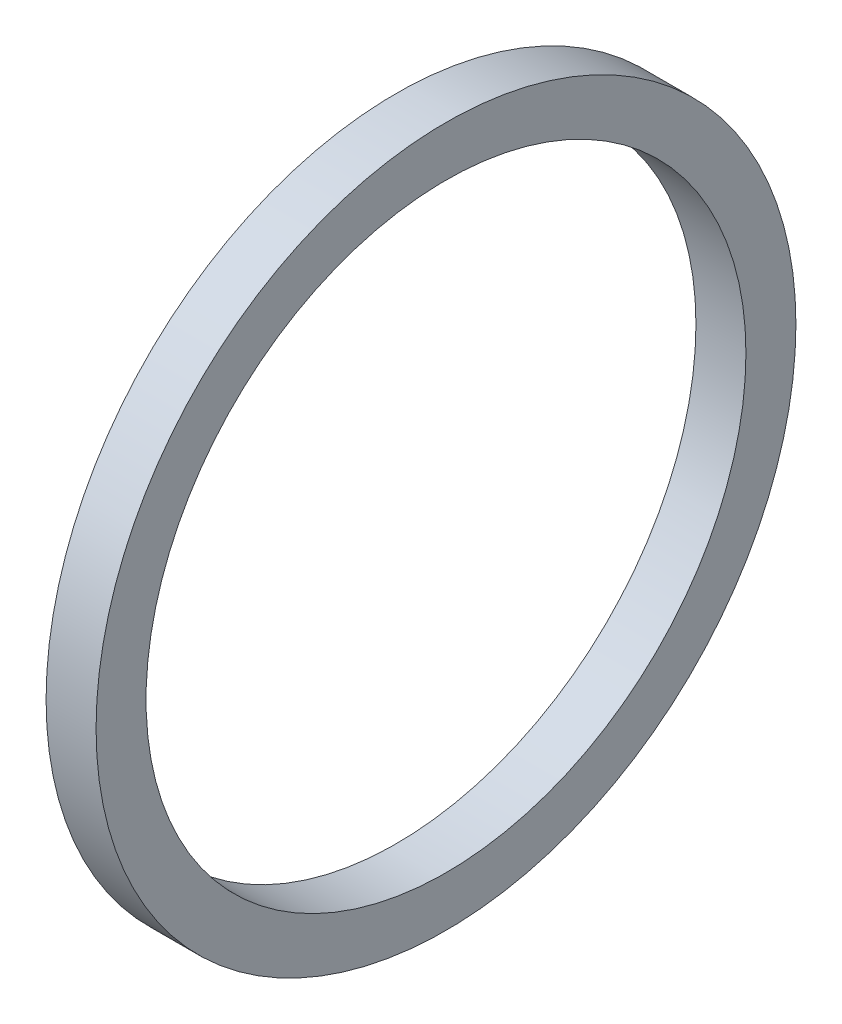
ISO-10303-21;
HEADER;
FILE_DESCRIPTION(('STEP AP214'),'2;1');
FILE_NAME('part.step','',(''),(''),'','','');
FILE_SCHEMA(('AUTOMOTIVE_DESIGN { 1 0 10303 214 1 1 1 1 }'));
ENDSEC;
DATA;
#1=APPLICATION_CONTEXT('core data for automotive mechanical design processes');
#2=APPLICATION_PROTOCOL_DEFINITION('international standard','automotive_design',2000,#1);
#3=PRODUCT_CONTEXT('',#1,'mechanical');
#4=PRODUCT('Part','Part','',(#3));
#5=PRODUCT_RELATED_PRODUCT_CATEGORY('part','',(#4));
#6=PRODUCT_DEFINITION_FORMATION('','',#4);
#7=PRODUCT_DEFINITION_CONTEXT('part definition',#1,'design');
#8=PRODUCT_DEFINITION('design','',#6,#7);
#9=PRODUCT_DEFINITION_SHAPE('','',#8);
#10=(LENGTH_UNIT() NAMED_UNIT(*) SI_UNIT(.MILLI.,.METRE.));
#11=(NAMED_UNIT(*) PLANE_ANGLE_UNIT() SI_UNIT($,.RADIAN.));
#12=(NAMED_UNIT(*) SI_UNIT($,.STERADIAN.) SOLID_ANGLE_UNIT());
#13=UNCERTAINTY_MEASURE_WITH_UNIT(LENGTH_MEASURE(1.E-05),#10,'distance_accuracy_value','');
#14=(GEOMETRIC_REPRESENTATION_CONTEXT(3) GLOBAL_UNCERTAINTY_ASSIGNED_CONTEXT((#13)) GLOBAL_UNIT_ASSIGNED_CONTEXT((#10,
#11,#12)) REPRESENTATION_CONTEXT('',''));
#15=CARTESIAN_POINT('',(0.,0.,0.));
#16=DIRECTION('',(0.,0.,1.));
#17=DIRECTION('',(1.,0.,0.));
#18=AXIS2_PLACEMENT_3D('',#15,#16,#17);
#19=CARTESIAN_POINT('',(0.,76.2,0.));
#20=DIRECTION('',(1.,0.,0.));
#21=DIRECTION('',(0.,0.,-1.));
#22=AXIS2_PLACEMENT_3D('',#19,#20,#21);
#23=PLANE('',#22);
#24=CARTESIAN_POINT('',(0.,0.,0.));
#25=DIRECTION('',(1.,0.,0.));
#26=DIRECTION('',(0.,0.,-1.));
#27=AXIS2_PLACEMENT_3D('',#24,#25,#26);
#28=CIRCLE('',#27,88.9);
#29=CARTESIAN_POINT('',(0.,0.,-88.9));
#30=VERTEX_POINT('',#29);
#31=EDGE_CURVE('E10',#30,#30,#28,.T.);
#32=ORIENTED_EDGE('',*,*,#31,.T.);
#33=EDGE_LOOP('',(#32));
#34=FACE_BOUND('',#33,.T.);
#35=CARTESIAN_POINT('',(0.,0.,0.));
#36=DIRECTION('',(1.,0.,0.));
#37=DIRECTION('',(0.,0.,-1.));
#38=AXIS2_PLACEMENT_3D('',#35,#36,#37);
#39=CIRCLE('',#38,76.2);
#40=CARTESIAN_POINT('',(0.,0.,-76.2));
#41=VERTEX_POINT('',#40);
#42=EDGE_CURVE('E45',#41,#41,#39,.T.);
#43=ORIENTED_EDGE('',*,*,#42,.F.);
#44=EDGE_LOOP('',(#43));
#45=FACE_BOUND('',#44,.T.);
#46=ADVANCED_FACE('F31',(#34,#45),#23,.T.);
#47=CARTESIAN_POINT('',(0.,0.,0.));
#48=DIRECTION('',(1.,0.,0.));
#49=DIRECTION('',(0.,0.,-1.));
#50=AXIS2_PLACEMENT_3D('',#47,#48,#49);
#51=CYLINDRICAL_SURFACE('',#50,88.9);
#52=CARTESIAN_POINT('',(-12.7,0.,0.));
#53=DIRECTION('',(1.,0.,0.));
#54=DIRECTION('',(0.,0.,-1.));
#55=AXIS2_PLACEMENT_3D('',#52,#53,#54);
#56=CIRCLE('',#55,88.9);
#57=CARTESIAN_POINT('',(-12.7,0.,-88.9));
#58=VERTEX_POINT('',#57);
#59=EDGE_CURVE('E37',#58,#58,#56,.T.);
#60=ORIENTED_EDGE('',*,*,#59,.T.);
#61=EDGE_LOOP('',(#60));
#62=FACE_BOUND('',#61,.T.);
#63=ORIENTED_EDGE('',*,*,#31,.F.);
#64=EDGE_LOOP('',(#63));
#65=FACE_BOUND('',#64,.T.);
#66=ADVANCED_FACE('F55',(#62,#65),#51,.T.);
#67=CARTESIAN_POINT('',(-12.7,76.2,0.));
#68=DIRECTION('',(-1.,0.,0.));
#69=DIRECTION('',(0.,0.,1.));
#70=AXIS2_PLACEMENT_3D('',#67,#68,#69);
#71=PLANE('',#70);
#72=CARTESIAN_POINT('',(-12.7,0.,0.));
#73=DIRECTION('',(1.,0.,0.));
#74=DIRECTION('',(0.,0.,-1.));
#75=AXIS2_PLACEMENT_3D('',#72,#73,#74);
#76=CIRCLE('',#75,76.2);
#77=CARTESIAN_POINT('',(-12.7,0.,-76.2));
#78=VERTEX_POINT('',#77);
#79=EDGE_CURVE('E41',#78,#78,#76,.T.);
#80=ORIENTED_EDGE('',*,*,#79,.T.);
#81=EDGE_LOOP('',(#80));
#82=FACE_BOUND('',#81,.T.);
#83=ORIENTED_EDGE('',*,*,#59,.F.);
#84=EDGE_LOOP('',(#83));
#85=FACE_BOUND('',#84,.T.);
#86=ADVANCED_FACE('F59',(#82,#85),#71,.T.);
#87=CARTESIAN_POINT('',(0.,0.,0.));
#88=DIRECTION('',(1.,0.,0.));
#89=DIRECTION('',(0.,0.,-1.));
#90=AXIS2_PLACEMENT_3D('',#87,#88,#89);
#91=CYLINDRICAL_SURFACE('',#90,76.2);
#92=ORIENTED_EDGE('',*,*,#42,.T.);
#93=EDGE_LOOP('',(#92));
#94=FACE_BOUND('',#93,.T.);
#95=ORIENTED_EDGE('',*,*,#79,.F.);
#96=EDGE_LOOP('',(#95));
#97=FACE_BOUND('',#96,.T.);
#98=ADVANCED_FACE('F51',(#94,#97),#91,.F.);
#99=CLOSED_SHELL('',(#46,#66,#86,#98));
#100=MANIFOLD_SOLID_BREP('B2',#99);
#101=ADVANCED_BREP_SHAPE_REPRESENTATION('',(#18,#100),#14);
#102=SHAPE_DEFINITION_REPRESENTATION(#9,#101);
ENDSEC;
END-ISO-10303-21;
